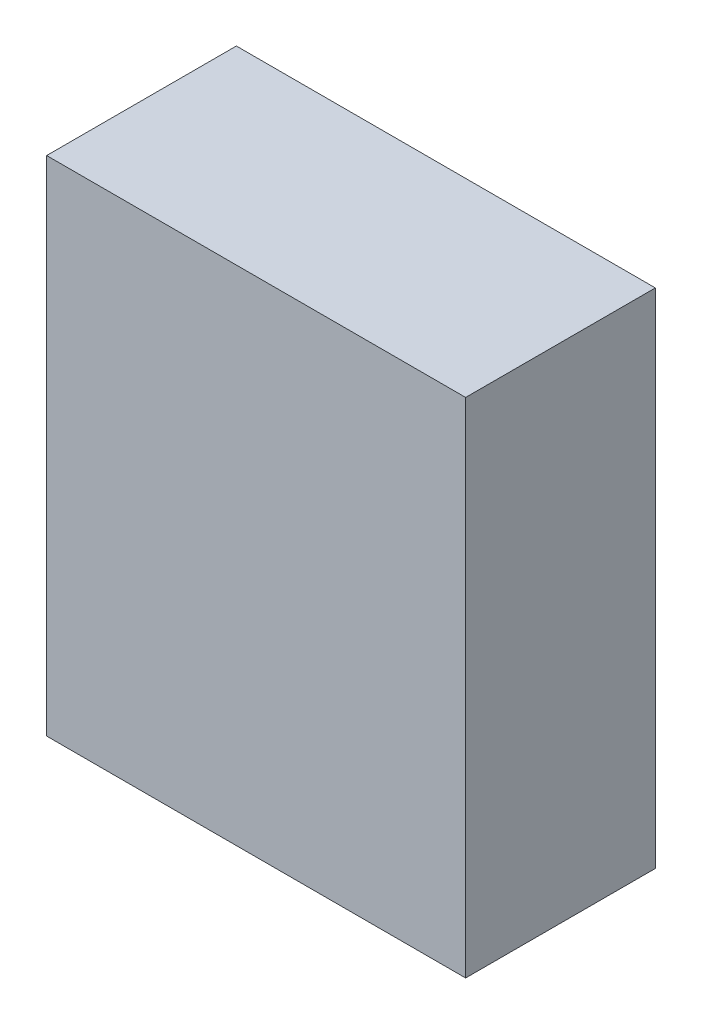
ISO-10303-21;
HEADER;
FILE_DESCRIPTION(('STEP AP214'),'2;1');
FILE_NAME('part.step','',(''),(''),'','','');
FILE_SCHEMA(('AUTOMOTIVE_DESIGN { 1 0 10303 214 1 1 1 1 }'));
ENDSEC;
DATA;
#1=APPLICATION_CONTEXT('core data for automotive mechanical design processes');
#2=APPLICATION_PROTOCOL_DEFINITION('international standard','automotive_design',2000,#1);
#3=PRODUCT_CONTEXT('',#1,'mechanical');
#4=PRODUCT('Part','Part','',(#3));
#5=PRODUCT_RELATED_PRODUCT_CATEGORY('part','',(#4));
#6=PRODUCT_DEFINITION_FORMATION('','',#4);
#7=PRODUCT_DEFINITION_CONTEXT('part definition',#1,'design');
#8=PRODUCT_DEFINITION('design','',#6,#7);
#9=PRODUCT_DEFINITION_SHAPE('','',#8);
#10=(LENGTH_UNIT() NAMED_UNIT(*) SI_UNIT(.MILLI.,.METRE.));
#11=(NAMED_UNIT(*) PLANE_ANGLE_UNIT() SI_UNIT($,.RADIAN.));
#12=(NAMED_UNIT(*) SI_UNIT($,.STERADIAN.) SOLID_ANGLE_UNIT());
#13=UNCERTAINTY_MEASURE_WITH_UNIT(LENGTH_MEASURE(1.E-05),#10,'distance_accuracy_value','');
#14=(GEOMETRIC_REPRESENTATION_CONTEXT(3) GLOBAL_UNCERTAINTY_ASSIGNED_CONTEXT((#13)) GLOBAL_UNIT_ASSIGNED_CONTEXT((#10,
#11,#12)) REPRESENTATION_CONTEXT('',''));
#15=CARTESIAN_POINT('',(0.,0.,0.));
#16=DIRECTION('',(0.,0.,1.));
#17=DIRECTION('',(1.,0.,0.));
#18=AXIS2_PLACEMENT_3D('',#15,#16,#17);
#19=CARTESIAN_POINT('',(2.54,3.048,0.));
#20=DIRECTION('',(0.,-1.,0.));
#21=DIRECTION('',(0.,0.,-1.));
#22=AXIS2_PLACEMENT_3D('',#19,#20,#21);
#23=PLANE('',#22);
#24=DIRECTION('',(-1.,0.,0.));
#25=VECTOR('',#24,1.);
#26=CARTESIAN_POINT('',(2.54,3.048,0.));
#27=LINE('',#26,#25);
#28=CARTESIAN_POINT('',(2.54,3.048,0.));
#29=VERTEX_POINT('',#28);
#30=CARTESIAN_POINT('',(-2.54,3.048,0.));
#31=VERTEX_POINT('',#30);
#32=EDGE_CURVE('E11',#29,#31,#27,.T.);
#33=ORIENTED_EDGE('',*,*,#32,.T.);
#34=DIRECTION('',(0.,0.,1.));
#35=VECTOR('',#34,1.);
#36=CARTESIAN_POINT('',(-2.54,3.048,0.));
#37=LINE('',#36,#35);
#38=CARTESIAN_POINT('',(-2.54,3.048,2.30000048));
#39=VERTEX_POINT('',#38);
#40=EDGE_CURVE('E27',#31,#39,#37,.T.);
#41=ORIENTED_EDGE('',*,*,#40,.T.);
#42=DIRECTION('',(-1.,0.,0.));
#43=VECTOR('',#42,1.);
#44=CARTESIAN_POINT('',(2.54,3.048,2.30000048));
#45=LINE('',#44,#43);
#46=CARTESIAN_POINT('',(2.54,3.048,2.30000048));
#47=VERTEX_POINT('',#46);
#48=EDGE_CURVE('E94',#47,#39,#45,.T.);
#49=ORIENTED_EDGE('',*,*,#48,.F.);
#50=DIRECTION('',(0.,0.,1.));
#51=VECTOR('',#50,1.);
#52=CARTESIAN_POINT('',(2.54,3.048,0.));
#53=LINE('',#52,#51);
#54=EDGE_CURVE('E88',#29,#47,#53,.T.);
#55=ORIENTED_EDGE('',*,*,#54,.F.);
#56=EDGE_LOOP('',(#33,#41,#49,#55));
#57=FACE_BOUND('',#56,.T.);
#58=ADVANCED_FACE('F16',(#57),#23,.F.);
#59=CARTESIAN_POINT('',(-2.54,3.048,0.));
#60=DIRECTION('',(1.,0.,0.));
#61=DIRECTION('',(0.,1.,0.));
#62=AXIS2_PLACEMENT_3D('',#59,#60,#61);
#63=PLANE('',#62);
#64=DIRECTION('',(0.,-1.,0.));
#65=VECTOR('',#64,1.);
#66=CARTESIAN_POINT('',(-2.54,3.048,0.));
#67=LINE('',#66,#65);
#68=CARTESIAN_POINT('',(-2.54,-3.048,0.));
#69=VERTEX_POINT('',#68);
#70=EDGE_CURVE('E98',#31,#69,#67,.T.);
#71=ORIENTED_EDGE('',*,*,#70,.T.);
#72=DIRECTION('',(0.,0.,1.));
#73=VECTOR('',#72,1.);
#74=CARTESIAN_POINT('',(-2.54,-3.048,0.));
#75=LINE('',#74,#73);
#76=CARTESIAN_POINT('',(-2.54,-3.048,2.30000048));
#77=VERTEX_POINT('',#76);
#78=EDGE_CURVE('E82',#69,#77,#75,.T.);
#79=ORIENTED_EDGE('',*,*,#78,.T.);
#80=DIRECTION('',(0.,-1.,0.));
#81=VECTOR('',#80,1.);
#82=CARTESIAN_POINT('',(-2.54,3.048,2.30000048));
#83=LINE('',#82,#81);
#84=EDGE_CURVE('E102',#39,#77,#83,.T.);
#85=ORIENTED_EDGE('',*,*,#84,.F.);
#86=ORIENTED_EDGE('',*,*,#40,.F.);
#87=EDGE_LOOP('',(#71,#79,#85,#86));
#88=FACE_BOUND('',#87,.T.);
#89=ADVANCED_FACE('F125',(#88),#63,.F.);
#90=CARTESIAN_POINT('',(-2.54,-3.048,0.));
#91=DIRECTION('',(0.,1.,0.));
#92=DIRECTION('',(1.,0.,0.));
#93=AXIS2_PLACEMENT_3D('',#90,#91,#92);
#94=PLANE('',#93);
#95=DIRECTION('',(1.,0.,0.));
#96=VECTOR('',#95,1.);
#97=CARTESIAN_POINT('',(-2.54,-3.048,0.));
#98=LINE('',#97,#96);
#99=CARTESIAN_POINT('',(2.54,-3.048,0.));
#100=VERTEX_POINT('',#99);
#101=EDGE_CURVE('E20',#69,#100,#98,.T.);
#102=ORIENTED_EDGE('',*,*,#101,.T.);
#103=DIRECTION('',(0.,0.,1.));
#104=VECTOR('',#103,1.);
#105=CARTESIAN_POINT('',(2.54,-3.048,0.));
#106=LINE('',#105,#104);
#107=CARTESIAN_POINT('',(2.54,-3.048,2.30000048));
#108=VERTEX_POINT('',#107);
#109=EDGE_CURVE('E67',#100,#108,#106,.T.);
#110=ORIENTED_EDGE('',*,*,#109,.T.);
#111=DIRECTION('',(1.,0.,0.));
#112=VECTOR('',#111,1.);
#113=CARTESIAN_POINT('',(-2.54,-3.048,2.30000048));
#114=LINE('',#113,#112);
#115=EDGE_CURVE('E59',#77,#108,#114,.T.);
#116=ORIENTED_EDGE('',*,*,#115,.F.);
#117=ORIENTED_EDGE('',*,*,#78,.F.);
#118=EDGE_LOOP('',(#102,#110,#116,#117));
#119=FACE_BOUND('',#118,.T.);
#120=ADVANCED_FACE('F80',(#119),#94,.F.);
#121=CARTESIAN_POINT('',(2.54,-3.048,0.));
#122=DIRECTION('',(-1.,0.,0.));
#123=DIRECTION('',(0.,0.,1.));
#124=AXIS2_PLACEMENT_3D('',#121,#122,#123);
#125=PLANE('',#124);
#126=DIRECTION('',(0.,1.,0.));
#127=VECTOR('',#126,1.);
#128=CARTESIAN_POINT('',(2.54,-3.048,0.));
#129=LINE('',#128,#127);
#130=EDGE_CURVE('E73',#100,#29,#129,.T.);
#131=ORIENTED_EDGE('',*,*,#130,.T.);
#132=ORIENTED_EDGE('',*,*,#54,.T.);
#133=DIRECTION('',(0.,1.,0.));
#134=VECTOR('',#133,1.);
#135=CARTESIAN_POINT('',(2.54,-3.048,2.30000048));
#136=LINE('',#135,#134);
#137=EDGE_CURVE('E74',#108,#47,#136,.T.);
#138=ORIENTED_EDGE('',*,*,#137,.F.);
#139=ORIENTED_EDGE('',*,*,#109,.F.);
#140=EDGE_LOOP('',(#131,#132,#138,#139));
#141=FACE_BOUND('',#140,.T.);
#142=ADVANCED_FACE('F69',(#141),#125,.F.);
#143=CARTESIAN_POINT('',(2.54,3.048,0.));
#144=DIRECTION('',(0.,0.,-1.));
#145=DIRECTION('',(0.,-1.,0.));
#146=AXIS2_PLACEMENT_3D('',#143,#144,#145);
#147=PLANE('',#146);
#148=ORIENTED_EDGE('',*,*,#130,.F.);
#149=ORIENTED_EDGE('',*,*,#101,.F.);
#150=ORIENTED_EDGE('',*,*,#70,.F.);
#151=ORIENTED_EDGE('',*,*,#32,.F.);
#152=EDGE_LOOP('',(#148,#149,#150,#151));
#153=FACE_BOUND('',#152,.T.);
#154=ADVANCED_FACE('F18',(#153),#147,.T.);
#155=CARTESIAN_POINT('',(2.54,3.048,2.30000048));
#156=DIRECTION('',(0.,0.,-1.));
#157=DIRECTION('',(0.,-1.,0.));
#158=AXIS2_PLACEMENT_3D('',#155,#156,#157);
#159=PLANE('',#158);
#160=ORIENTED_EDGE('',*,*,#48,.T.);
#161=ORIENTED_EDGE('',*,*,#84,.T.);
#162=ORIENTED_EDGE('',*,*,#115,.T.);
#163=ORIENTED_EDGE('',*,*,#137,.T.);
#164=EDGE_LOOP('',(#160,#161,#162,#163));
#165=FACE_BOUND('',#164,.T.);
#166=ADVANCED_FACE('F112',(#165),#159,.F.);
#167=CLOSED_SHELL('',(#58,#89,#120,#142,#154,#166));
#168=MANIFOLD_SOLID_BREP('B1',#167);
#169=ADVANCED_BREP_SHAPE_REPRESENTATION('',(#18,#168),#14);
#170=SHAPE_DEFINITION_REPRESENTATION(#9,#169);
ENDSEC;
END-ISO-10303-21;
